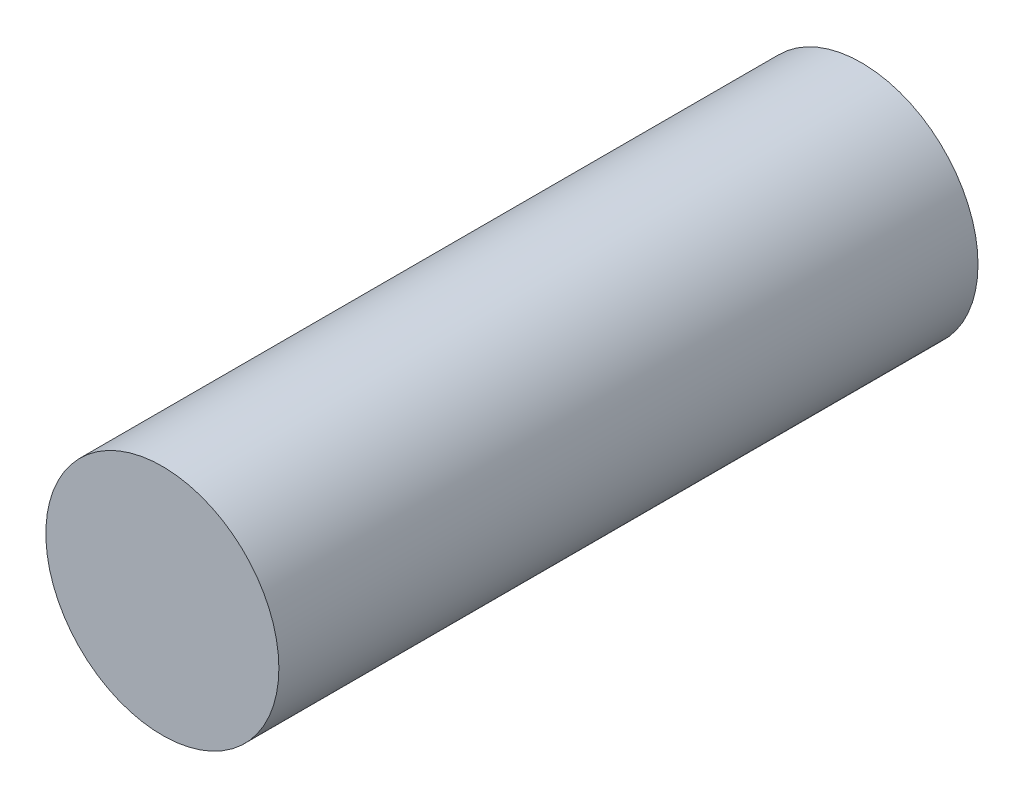
ISO-10303-21;
HEADER;
FILE_DESCRIPTION(('STEP AP214'),'2;1');
FILE_NAME('part.step','',(''),(''),'','','');
FILE_SCHEMA(('AUTOMOTIVE_DESIGN { 1 0 10303 214 1 1 1 1 }'));
ENDSEC;
DATA;
#1=APPLICATION_CONTEXT('core data for automotive mechanical design processes');
#2=APPLICATION_PROTOCOL_DEFINITION('international standard','automotive_design',2000,#1);
#3=PRODUCT_CONTEXT('',#1,'mechanical');
#4=PRODUCT('Part','Part','',(#3));
#5=PRODUCT_RELATED_PRODUCT_CATEGORY('part','',(#4));
#6=PRODUCT_DEFINITION_FORMATION('','',#4);
#7=PRODUCT_DEFINITION_CONTEXT('part definition',#1,'design');
#8=PRODUCT_DEFINITION('design','',#6,#7);
#9=PRODUCT_DEFINITION_SHAPE('','',#8);
#10=(LENGTH_UNIT() NAMED_UNIT(*) SI_UNIT(.MILLI.,.METRE.));
#11=(NAMED_UNIT(*) PLANE_ANGLE_UNIT() SI_UNIT($,.RADIAN.));
#12=(NAMED_UNIT(*) SI_UNIT($,.STERADIAN.) SOLID_ANGLE_UNIT());
#13=UNCERTAINTY_MEASURE_WITH_UNIT(LENGTH_MEASURE(1.E-05),#10,'distance_accuracy_value','');
#14=(GEOMETRIC_REPRESENTATION_CONTEXT(3) GLOBAL_UNCERTAINTY_ASSIGNED_CONTEXT((#13)) GLOBAL_UNIT_ASSIGNED_CONTEXT((#10,
#11,#12)) REPRESENTATION_CONTEXT('',''));
#15=CARTESIAN_POINT('',(0.,0.,0.));
#16=DIRECTION('',(0.,0.,1.));
#17=DIRECTION('',(1.,0.,0.));
#18=AXIS2_PLACEMENT_3D('',#15,#16,#17);
#19=CARTESIAN_POINT('',(0.,0.,18.));
#20=DIRECTION('',(0.,0.,-1.));
#21=DIRECTION('',(-1.,0.,0.));
#22=AXIS2_PLACEMENT_3D('',#19,#20,#21);
#23=CYLINDRICAL_SURFACE('',#22,3.);
#24=CARTESIAN_POINT('',(0.,0.,18.));
#25=DIRECTION('',(0.,0.,1.));
#26=DIRECTION('',(1.,0.,0.));
#27=AXIS2_PLACEMENT_3D('',#24,#25,#26);
#28=CIRCLE('',#27,3.);
#29=CARTESIAN_POINT('',(3.,0.,18.));
#30=VERTEX_POINT('',#29);
#31=EDGE_CURVE('E10',#30,#30,#28,.T.);
#32=ORIENTED_EDGE('',*,*,#31,.F.);
#33=EDGE_LOOP('',(#32));
#34=FACE_BOUND('',#33,.T.);
#35=CARTESIAN_POINT('',(0.,0.,0.));
#36=DIRECTION('',(0.,0.,1.));
#37=DIRECTION('',(1.,0.,0.));
#38=AXIS2_PLACEMENT_3D('',#35,#36,#37);
#39=CIRCLE('',#38,3.);
#40=CARTESIAN_POINT('',(3.,0.,0.));
#41=VERTEX_POINT('',#40);
#42=EDGE_CURVE('E35',#41,#41,#39,.T.);
#43=ORIENTED_EDGE('',*,*,#42,.T.);
#44=EDGE_LOOP('',(#43));
#45=FACE_BOUND('',#44,.T.);
#46=ADVANCED_FACE('F29',(#34,#45),#23,.T.);
#47=CARTESIAN_POINT('',(0.,0.,18.));
#48=DIRECTION('',(0.,0.,1.));
#49=DIRECTION('',(1.,0.,0.));
#50=AXIS2_PLACEMENT_3D('',#47,#48,#49);
#51=PLANE('',#50);
#52=ORIENTED_EDGE('',*,*,#31,.T.);
#53=EDGE_LOOP('',(#52));
#54=FACE_BOUND('',#53,.T.);
#55=ADVANCED_FACE('F44',(#54),#51,.T.);
#56=CARTESIAN_POINT('',(0.,0.,0.));
#57=DIRECTION('',(0.,0.,1.));
#58=DIRECTION('',(1.,0.,0.));
#59=AXIS2_PLACEMENT_3D('',#56,#57,#58);
#60=PLANE('',#59);
#61=ORIENTED_EDGE('',*,*,#42,.F.);
#62=EDGE_LOOP('',(#61));
#63=FACE_BOUND('',#62,.T.);
#64=ADVANCED_FACE('F42',(#63),#60,.F.);
#65=CLOSED_SHELL('',(#46,#55,#64));
#66=MANIFOLD_SOLID_BREP('B2',#65);
#67=ADVANCED_BREP_SHAPE_REPRESENTATION('',(#18,#66),#14);
#68=SHAPE_DEFINITION_REPRESENTATION(#9,#67);
ENDSEC;
END-ISO-10303-21;
